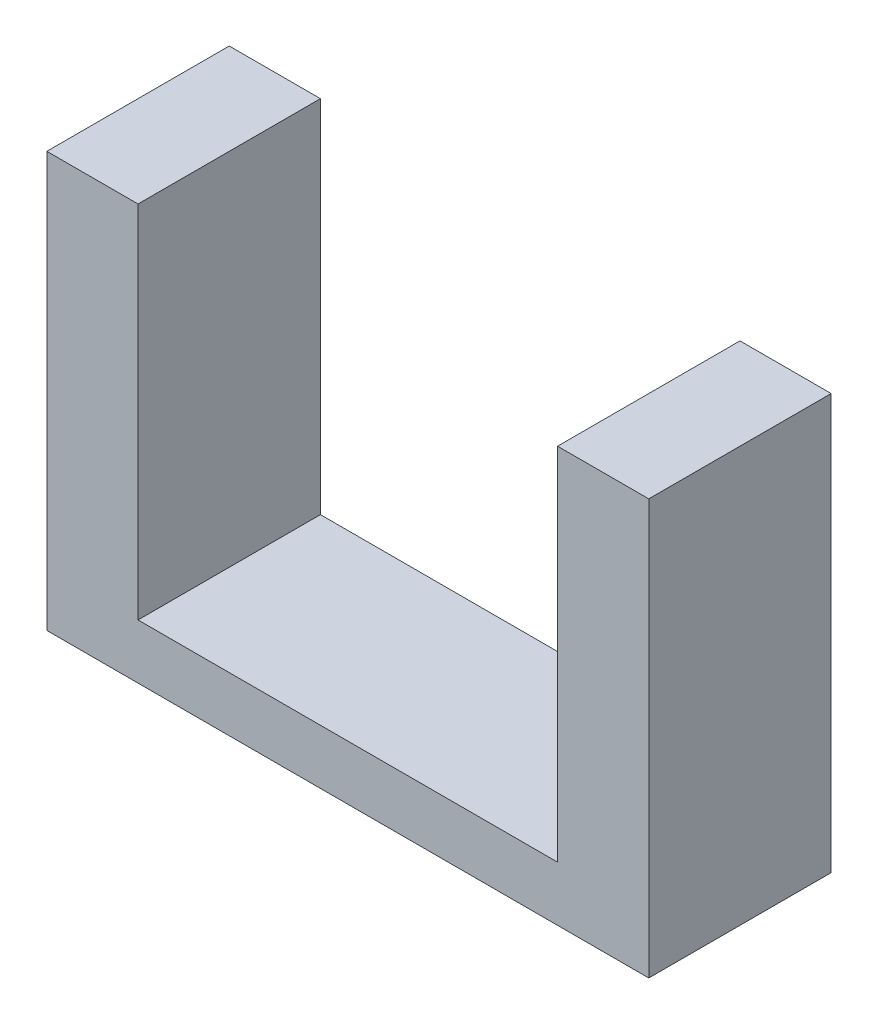
ISO-10303-21;
HEADER;
FILE_DESCRIPTION(('STEP AP214'),'2;1');
FILE_NAME('part.step','',(''),(''),'','','');
FILE_SCHEMA(('AUTOMOTIVE_DESIGN { 1 0 10303 214 1 1 1 1 }'));
ENDSEC;
DATA;
#1=APPLICATION_CONTEXT('core data for automotive mechanical design processes');
#2=APPLICATION_PROTOCOL_DEFINITION('international standard','automotive_design',2000,#1);
#3=PRODUCT_CONTEXT('',#1,'mechanical');
#4=PRODUCT('Part','Part','',(#3));
#5=PRODUCT_RELATED_PRODUCT_CATEGORY('part','',(#4));
#6=PRODUCT_DEFINITION_FORMATION('','',#4);
#7=PRODUCT_DEFINITION_CONTEXT('part definition',#1,'design');
#8=PRODUCT_DEFINITION('design','',#6,#7);
#9=PRODUCT_DEFINITION_SHAPE('','',#8);
#10=(LENGTH_UNIT() NAMED_UNIT(*) SI_UNIT(.MILLI.,.METRE.));
#11=(NAMED_UNIT(*) PLANE_ANGLE_UNIT() SI_UNIT($,.RADIAN.));
#12=(NAMED_UNIT(*) SI_UNIT($,.STERADIAN.) SOLID_ANGLE_UNIT());
#13=UNCERTAINTY_MEASURE_WITH_UNIT(LENGTH_MEASURE(1.E-05),#10,'distance_accuracy_value','');
#14=(GEOMETRIC_REPRESENTATION_CONTEXT(3) GLOBAL_UNCERTAINTY_ASSIGNED_CONTEXT((#13)) GLOBAL_UNIT_ASSIGNED_CONTEXT((#10,
#11,#12)) REPRESENTATION_CONTEXT('',''));
#15=CARTESIAN_POINT('',(0.,0.,0.));
#16=DIRECTION('',(0.,0.,1.));
#17=DIRECTION('',(1.,0.,0.));
#18=AXIS2_PLACEMENT_3D('',#15,#16,#17);
#19=CARTESIAN_POINT('',(0.,3.,-5.));
#20=DIRECTION('',(0.,0.,-1.));
#21=DIRECTION('',(-1.,0.,0.));
#22=AXIS2_PLACEMENT_3D('',#19,#20,#21);
#23=PLANE('',#22);
#24=DIRECTION('',(1.,0.,0.));
#25=VECTOR('',#24,1.);
#26=CARTESIAN_POINT('',(0.,0.,-5.));
#27=LINE('',#26,#25);
#28=CARTESIAN_POINT('',(-16.5,0.,-5.));
#29=VERTEX_POINT('',#28);
#30=CARTESIAN_POINT('',(16.5,0.,-5.));
#31=VERTEX_POINT('',#30);
#32=EDGE_CURVE('E123',#29,#31,#27,.T.);
#33=ORIENTED_EDGE('',*,*,#32,.F.);
#34=DIRECTION('',(0.,-1.,0.));
#35=VECTOR('',#34,1.);
#36=CARTESIAN_POINT('',(-16.5,22.75,-5.));
#37=LINE('',#36,#35);
#38=CARTESIAN_POINT('',(-16.5,22.75,-5.));
#39=VERTEX_POINT('',#38);
#40=EDGE_CURVE('E106',#39,#29,#37,.T.);
#41=ORIENTED_EDGE('',*,*,#40,.F.);
#42=DIRECTION('',(-1.,0.,0.));
#43=VECTOR('',#42,1.);
#44=CARTESIAN_POINT('',(-11.5,22.75,-5.));
#45=LINE('',#44,#43);
#46=CARTESIAN_POINT('',(-11.5,22.75,-5.));
#47=VERTEX_POINT('',#46);
#48=EDGE_CURVE('E112',#47,#39,#45,.T.);
#49=ORIENTED_EDGE('',*,*,#48,.F.);
#50=DIRECTION('',(0.,-1.,0.));
#51=VECTOR('',#50,1.);
#52=CARTESIAN_POINT('',(-11.5,22.75,-5.));
#53=LINE('',#52,#51);
#54=CARTESIAN_POINT('',(-11.5,3.,-5.));
#55=VERTEX_POINT('',#54);
#56=EDGE_CURVE('E246',#47,#55,#53,.T.);
#57=ORIENTED_EDGE('',*,*,#56,.T.);
#58=DIRECTION('',(1.,0.,0.));
#59=VECTOR('',#58,1.);
#60=CARTESIAN_POINT('',(0.,3.,-5.));
#61=LINE('',#60,#59);
#62=CARTESIAN_POINT('',(11.5,3.,-5.));
#63=VERTEX_POINT('',#62);
#64=EDGE_CURVE('E153',#55,#63,#61,.T.);
#65=ORIENTED_EDGE('',*,*,#64,.T.);
#66=DIRECTION('',(0.,-1.,0.));
#67=VECTOR('',#66,1.);
#68=CARTESIAN_POINT('',(11.5,22.75,-5.));
#69=LINE('',#68,#67);
#70=CARTESIAN_POINT('',(11.5,22.75,-5.));
#71=VERTEX_POINT('',#70);
#72=EDGE_CURVE('E140',#71,#63,#69,.T.);
#73=ORIENTED_EDGE('',*,*,#72,.F.);
#74=DIRECTION('',(-1.,0.,0.));
#75=VECTOR('',#74,1.);
#76=CARTESIAN_POINT('',(11.5,22.75,-5.));
#77=LINE('',#76,#75);
#78=CARTESIAN_POINT('',(16.5,22.75,-5.));
#79=VERTEX_POINT('',#78);
#80=EDGE_CURVE('E139',#79,#71,#77,.T.);
#81=ORIENTED_EDGE('',*,*,#80,.F.);
#82=DIRECTION('',(0.,-1.,0.));
#83=VECTOR('',#82,1.);
#84=CARTESIAN_POINT('',(16.5,22.75,-5.));
#85=LINE('',#84,#83);
#86=EDGE_CURVE('E144',#79,#31,#85,.T.);
#87=ORIENTED_EDGE('',*,*,#86,.T.);
#88=EDGE_LOOP('',(#33,#41,#49,#57,#65,#73,#81,#87));
#89=FACE_BOUND('',#88,.T.);
#90=ADVANCED_FACE('F34',(#89),#23,.T.);
#91=CARTESIAN_POINT('',(0.,3.,5.));
#92=DIRECTION('',(0.,0.,-1.));
#93=DIRECTION('',(-1.,0.,0.));
#94=AXIS2_PLACEMENT_3D('',#91,#92,#93);
#95=PLANE('',#94);
#96=DIRECTION('',(1.,0.,0.));
#97=VECTOR('',#96,1.);
#98=CARTESIAN_POINT('',(0.,0.,5.));
#99=LINE('',#98,#97);
#100=CARTESIAN_POINT('',(-16.5,0.,5.));
#101=VERTEX_POINT('',#100);
#102=CARTESIAN_POINT('',(16.5,0.,5.));
#103=VERTEX_POINT('',#102);
#104=EDGE_CURVE('E37',#101,#103,#99,.T.);
#105=ORIENTED_EDGE('',*,*,#104,.T.);
#106=DIRECTION('',(0.,-1.,0.));
#107=VECTOR('',#106,1.);
#108=CARTESIAN_POINT('',(16.5,22.75,5.));
#109=LINE('',#108,#107);
#110=CARTESIAN_POINT('',(16.5,22.75,5.));
#111=VERTEX_POINT('',#110);
#112=EDGE_CURVE('E146',#111,#103,#109,.T.);
#113=ORIENTED_EDGE('',*,*,#112,.F.);
#114=DIRECTION('',(1.,0.,0.));
#115=VECTOR('',#114,1.);
#116=CARTESIAN_POINT('',(11.5,22.75,5.));
#117=LINE('',#116,#115);
#118=CARTESIAN_POINT('',(11.5,22.75,5.));
#119=VERTEX_POINT('',#118);
#120=EDGE_CURVE('E135',#119,#111,#117,.T.);
#121=ORIENTED_EDGE('',*,*,#120,.F.);
#122=DIRECTION('',(0.,-1.,0.));
#123=VECTOR('',#122,1.);
#124=CARTESIAN_POINT('',(11.5,22.75,5.));
#125=LINE('',#124,#123);
#126=CARTESIAN_POINT('',(11.5,3.,5.));
#127=VERTEX_POINT('',#126);
#128=EDGE_CURVE('E149',#119,#127,#125,.T.);
#129=ORIENTED_EDGE('',*,*,#128,.T.);
#130=DIRECTION('',(1.,0.,0.));
#131=VECTOR('',#130,1.);
#132=CARTESIAN_POINT('',(0.,3.,5.));
#133=LINE('',#132,#131);
#134=CARTESIAN_POINT('',(-11.5,3.,5.));
#135=VERTEX_POINT('',#134);
#136=EDGE_CURVE('E11',#135,#127,#133,.T.);
#137=ORIENTED_EDGE('',*,*,#136,.F.);
#138=DIRECTION('',(0.,-1.,0.));
#139=VECTOR('',#138,1.);
#140=CARTESIAN_POINT('',(-11.5,22.75,5.));
#141=LINE('',#140,#139);
#142=CARTESIAN_POINT('',(-11.5,22.75,5.));
#143=VERTEX_POINT('',#142);
#144=EDGE_CURVE('E50',#143,#135,#141,.T.);
#145=ORIENTED_EDGE('',*,*,#144,.F.);
#146=DIRECTION('',(1.,0.,0.));
#147=VECTOR('',#146,1.);
#148=CARTESIAN_POINT('',(-11.5,22.75,5.));
#149=LINE('',#148,#147);
#150=CARTESIAN_POINT('',(-16.5,22.75,5.));
#151=VERTEX_POINT('',#150);
#152=EDGE_CURVE('E111',#151,#143,#149,.T.);
#153=ORIENTED_EDGE('',*,*,#152,.F.);
#154=DIRECTION('',(0.,-1.,0.));
#155=VECTOR('',#154,1.);
#156=CARTESIAN_POINT('',(-16.5,22.75,5.));
#157=LINE('',#156,#155);
#158=EDGE_CURVE('E108',#151,#101,#157,.T.);
#159=ORIENTED_EDGE('',*,*,#158,.T.);
#160=EDGE_LOOP('',(#105,#113,#121,#129,#137,#145,#153,#159));
#161=FACE_BOUND('',#160,.T.);
#162=ADVANCED_FACE('F159',(#161),#95,.F.);
#163=CARTESIAN_POINT('',(0.,3.,0.));
#164=DIRECTION('',(0.,1.,0.));
#165=DIRECTION('',(0.,0.,1.));
#166=AXIS2_PLACEMENT_3D('',#163,#164,#165);
#167=PLANE('',#166);
#168=DIRECTION('',(0.,0.,1.));
#169=VECTOR('',#168,1.);
#170=CARTESIAN_POINT('',(11.5,3.,0.));
#171=LINE('',#170,#169);
#172=EDGE_CURVE('E57',#63,#127,#171,.T.);
#173=ORIENTED_EDGE('',*,*,#172,.F.);
#174=ORIENTED_EDGE('',*,*,#64,.F.);
#175=DIRECTION('',(0.,0.,1.));
#176=VECTOR('',#175,1.);
#177=CARTESIAN_POINT('',(-11.5,3.,0.));
#178=LINE('',#177,#176);
#179=EDGE_CURVE('E42',#55,#135,#178,.T.);
#180=ORIENTED_EDGE('',*,*,#179,.T.);
#181=ORIENTED_EDGE('',*,*,#136,.T.);
#182=EDGE_LOOP('',(#173,#174,#180,#181));
#183=FACE_BOUND('',#182,.T.);
#184=ADVANCED_FACE('F167',(#183),#167,.T.);
#185=CARTESIAN_POINT('',(0.,0.,0.));
#186=DIRECTION('',(0.,1.,0.));
#187=DIRECTION('',(0.,0.,1.));
#188=AXIS2_PLACEMENT_3D('',#185,#186,#187);
#189=PLANE('',#188);
#190=ORIENTED_EDGE('',*,*,#32,.T.);
#191=DIRECTION('',(0.,0.,-1.));
#192=VECTOR('',#191,1.);
#193=CARTESIAN_POINT('',(16.5,0.,-5.));
#194=LINE('',#193,#192);
#195=EDGE_CURVE('E125',#103,#31,#194,.T.);
#196=ORIENTED_EDGE('',*,*,#195,.F.);
#197=ORIENTED_EDGE('',*,*,#104,.F.);
#198=DIRECTION('',(0.,0.,1.));
#199=VECTOR('',#198,1.);
#200=CARTESIAN_POINT('',(-16.5,0.,-5.));
#201=LINE('',#200,#199);
#202=EDGE_CURVE('E120',#29,#101,#201,.T.);
#203=ORIENTED_EDGE('',*,*,#202,.F.);
#204=EDGE_LOOP('',(#190,#196,#197,#203));
#205=FACE_BOUND('',#204,.T.);
#206=ADVANCED_FACE('F164',(#205),#189,.F.);
#207=CARTESIAN_POINT('',(11.5,22.75,-5.));
#208=DIRECTION('',(1.,0.,0.));
#209=DIRECTION('',(0.,0.,-1.));
#210=AXIS2_PLACEMENT_3D('',#207,#208,#209);
#211=PLANE('',#210);
#212=ORIENTED_EDGE('',*,*,#72,.T.);
#213=ORIENTED_EDGE('',*,*,#172,.T.);
#214=ORIENTED_EDGE('',*,*,#128,.F.);
#215=DIRECTION('',(0.,0.,1.));
#216=VECTOR('',#215,1.);
#217=CARTESIAN_POINT('',(11.5,22.75,-5.));
#218=LINE('',#217,#216);
#219=EDGE_CURVE('E128',#71,#119,#218,.T.);
#220=ORIENTED_EDGE('',*,*,#219,.F.);
#221=EDGE_LOOP('',(#212,#213,#214,#220));
#222=FACE_BOUND('',#221,.T.);
#223=ADVANCED_FACE('F166',(#222),#211,.F.);
#224=CARTESIAN_POINT('',(16.5,22.75,-5.));
#225=DIRECTION('',(-1.,0.,0.));
#226=DIRECTION('',(0.,0.,1.));
#227=AXIS2_PLACEMENT_3D('',#224,#225,#226);
#228=PLANE('',#227);
#229=ORIENTED_EDGE('',*,*,#195,.T.);
#230=ORIENTED_EDGE('',*,*,#86,.F.);
#231=DIRECTION('',(0.,0.,-1.));
#232=VECTOR('',#231,1.);
#233=CARTESIAN_POINT('',(16.5,22.75,-5.));
#234=LINE('',#233,#232);
#235=EDGE_CURVE('E137',#111,#79,#234,.T.);
#236=ORIENTED_EDGE('',*,*,#235,.F.);
#237=ORIENTED_EDGE('',*,*,#112,.T.);
#238=EDGE_LOOP('',(#229,#230,#236,#237));
#239=FACE_BOUND('',#238,.T.);
#240=ADVANCED_FACE('F162',(#239),#228,.F.);
#241=CARTESIAN_POINT('',(0.,22.75,0.));
#242=DIRECTION('',(0.,1.,0.));
#243=DIRECTION('',(0.,0.,1.));
#244=AXIS2_PLACEMENT_3D('',#241,#242,#243);
#245=PLANE('',#244);
#246=ORIENTED_EDGE('',*,*,#219,.T.);
#247=ORIENTED_EDGE('',*,*,#120,.T.);
#248=ORIENTED_EDGE('',*,*,#235,.T.);
#249=ORIENTED_EDGE('',*,*,#80,.T.);
#250=EDGE_LOOP('',(#246,#247,#248,#249));
#251=FACE_BOUND('',#250,.T.);
#252=ADVANCED_FACE('F208',(#251),#245,.T.);
#253=CARTESIAN_POINT('',(-16.5,22.75,-5.));
#254=DIRECTION('',(1.,0.,0.));
#255=DIRECTION('',(0.,0.,-1.));
#256=AXIS2_PLACEMENT_3D('',#253,#254,#255);
#257=PLANE('',#256);
#258=ORIENTED_EDGE('',*,*,#202,.T.);
#259=ORIENTED_EDGE('',*,*,#158,.F.);
#260=DIRECTION('',(0.,0.,1.));
#261=VECTOR('',#260,1.);
#262=CARTESIAN_POINT('',(-16.5,22.75,-5.));
#263=LINE('',#262,#261);
#264=EDGE_CURVE('E101',#39,#151,#263,.T.);
#265=ORIENTED_EDGE('',*,*,#264,.F.);
#266=ORIENTED_EDGE('',*,*,#40,.T.);
#267=EDGE_LOOP('',(#258,#259,#265,#266));
#268=FACE_BOUND('',#267,.T.);
#269=ADVANCED_FACE('F104',(#268),#257,.F.);
#270=CARTESIAN_POINT('',(-11.5,22.75,-5.));
#271=DIRECTION('',(-1.,0.,0.));
#272=DIRECTION('',(0.,0.,1.));
#273=AXIS2_PLACEMENT_3D('',#270,#271,#272);
#274=PLANE('',#273);
#275=ORIENTED_EDGE('',*,*,#179,.F.);
#276=ORIENTED_EDGE('',*,*,#56,.F.);
#277=DIRECTION('',(0.,0.,-1.));
#278=VECTOR('',#277,1.);
#279=CARTESIAN_POINT('',(-11.5,22.75,-5.));
#280=LINE('',#279,#278);
#281=EDGE_CURVE('E116',#143,#47,#280,.T.);
#282=ORIENTED_EDGE('',*,*,#281,.F.);
#283=ORIENTED_EDGE('',*,*,#144,.T.);
#284=EDGE_LOOP('',(#275,#276,#282,#283));
#285=FACE_BOUND('',#284,.T.);
#286=ADVANCED_FACE('F226',(#285),#274,.F.);
#287=CARTESIAN_POINT('',(0.,22.75,0.));
#288=DIRECTION('',(0.,1.,0.));
#289=DIRECTION('',(0.,0.,1.));
#290=AXIS2_PLACEMENT_3D('',#287,#288,#289);
#291=PLANE('',#290);
#292=ORIENTED_EDGE('',*,*,#48,.T.);
#293=ORIENTED_EDGE('',*,*,#264,.T.);
#294=ORIENTED_EDGE('',*,*,#152,.T.);
#295=ORIENTED_EDGE('',*,*,#281,.T.);
#296=EDGE_LOOP('',(#292,#293,#294,#295));
#297=FACE_BOUND('',#296,.T.);
#298=ADVANCED_FACE('F115',(#297),#291,.T.);
#299=CLOSED_SHELL('',(#90,#162,#184,#206,#223,#240,#252,#269,#286,#298));
#300=MANIFOLD_SOLID_BREP('B2',#299);
#301=ADVANCED_BREP_SHAPE_REPRESENTATION('',(#18,#300),#14);
#302=SHAPE_DEFINITION_REPRESENTATION(#9,#301);
ENDSEC;
END-ISO-10303-21;
